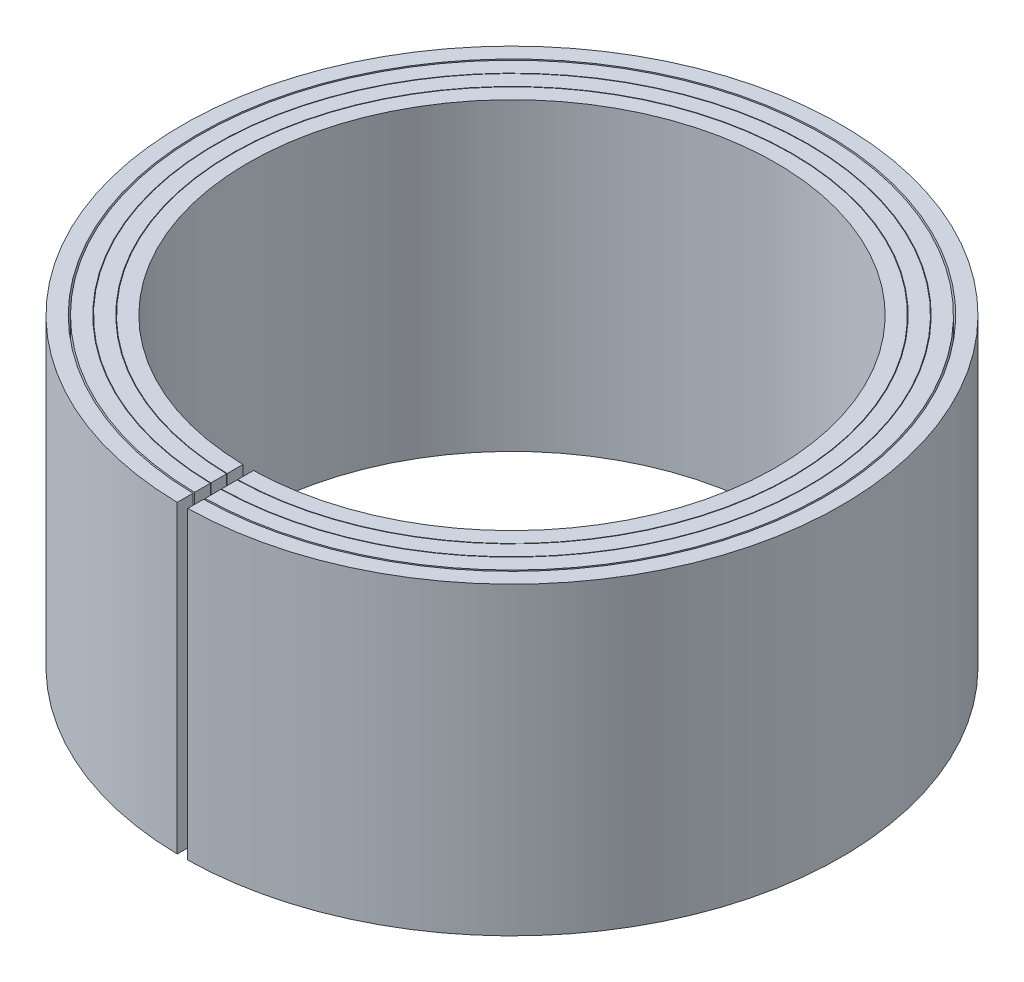
ISO-10303-21;
HEADER;
FILE_DESCRIPTION(('STEP AP214'),'2;1');
FILE_NAME('part.step','',(''),(''),'','','');
FILE_SCHEMA(('AUTOMOTIVE_DESIGN { 1 0 10303 214 1 1 1 1 }'));
ENDSEC;
DATA;
#1=APPLICATION_CONTEXT('core data for automotive mechanical design processes');
#2=APPLICATION_PROTOCOL_DEFINITION('international standard','automotive_design',2000,#1);
#3=PRODUCT_CONTEXT('',#1,'mechanical');
#4=PRODUCT('Part','Part','',(#3));
#5=PRODUCT_RELATED_PRODUCT_CATEGORY('part','',(#4));
#6=PRODUCT_DEFINITION_FORMATION('','',#4);
#7=PRODUCT_DEFINITION_CONTEXT('part definition',#1,'design');
#8=PRODUCT_DEFINITION('design','',#6,#7);
#9=PRODUCT_DEFINITION_SHAPE('','',#8);
#10=(LENGTH_UNIT() NAMED_UNIT(*) SI_UNIT(.MILLI.,.METRE.));
#11=(NAMED_UNIT(*) PLANE_ANGLE_UNIT() SI_UNIT($,.RADIAN.));
#12=(NAMED_UNIT(*) SI_UNIT($,.STERADIAN.) SOLID_ANGLE_UNIT());
#13=UNCERTAINTY_MEASURE_WITH_UNIT(LENGTH_MEASURE(1.E-05),#10,'distance_accuracy_value','');
#14=(GEOMETRIC_REPRESENTATION_CONTEXT(3) GLOBAL_UNCERTAINTY_ASSIGNED_CONTEXT((#13)) GLOBAL_UNIT_ASSIGNED_CONTEXT((#10,
#11,#12)) REPRESENTATION_CONTEXT('',''));
#15=CARTESIAN_POINT('',(0.,0.,0.));
#16=DIRECTION('',(0.,0.,1.));
#17=DIRECTION('',(1.,0.,0.));
#18=AXIS2_PLACEMENT_3D('',#15,#16,#17);
#19=CARTESIAN_POINT('',(0.,177.8,0.));
#20=DIRECTION('',(0.,1.,0.));
#21=DIRECTION('',(0.,0.,1.));
#22=AXIS2_PLACEMENT_3D('',#19,#20,#21);
#23=CYLINDRICAL_SURFACE('',#22,676.275);
#24=CARTESIAN_POINT('',(0.,914.4,0.));
#25=DIRECTION('',(0.,1.,0.));
#26=DIRECTION('',(0.,0.,1.));
#27=AXIS2_PLACEMENT_3D('',#24,#25,#26);
#28=CIRCLE('',#27,676.275);
#29=CARTESIAN_POINT('',(12.7000000000001,914.4,676.155740658171));
#30=VERTEX_POINT('',#29);
#31=CARTESIAN_POINT('',(-12.6999999999999,914.4,676.155740658171));
#32=VERTEX_POINT('',#31);
#33=EDGE_CURVE('E118',#30,#32,#28,.T.);
#34=ORIENTED_EDGE('',*,*,#33,.F.);
#35=DIRECTION('',(0.,1.,0.));
#36=VECTOR('',#35,1.);
#37=CARTESIAN_POINT('',(12.7000000000001,177.8,676.155740658171));
#38=LINE('',#37,#36);
#39=CARTESIAN_POINT('',(12.7000000000001,177.8,676.155740658171));
#40=VERTEX_POINT('',#39);
#41=EDGE_CURVE('E92',#30,#40,#38,.F.);
#42=ORIENTED_EDGE('',*,*,#41,.T.);
#43=CARTESIAN_POINT('',(0.,177.8,0.));
#44=DIRECTION('',(0.,1.,0.));
#45=DIRECTION('',(0.,0.,1.));
#46=AXIS2_PLACEMENT_3D('',#43,#44,#45);
#47=CIRCLE('',#46,676.275);
#48=CARTESIAN_POINT('',(-12.6999999999999,177.8,676.155740658171));
#49=VERTEX_POINT('',#48);
#50=EDGE_CURVE('E120',#40,#49,#47,.T.);
#51=ORIENTED_EDGE('',*,*,#50,.T.);
#52=DIRECTION('',(0.,1.,0.));
#53=VECTOR('',#52,1.);
#54=CARTESIAN_POINT('',(-12.6999999999999,177.8,676.155740658171));
#55=LINE('',#54,#53);
#56=EDGE_CURVE('E108',#49,#32,#55,.T.);
#57=ORIENTED_EDGE('',*,*,#56,.T.);
#58=EDGE_LOOP('',(#34,#42,#51,#57));
#59=FACE_BOUND('',#58,.T.);
#60=ADVANCED_FACE('F70',(#59),#23,.T.);
#61=CARTESIAN_POINT('',(0.,177.8,0.));
#62=DIRECTION('',(0.,1.,0.));
#63=DIRECTION('',(0.,0.,1.));
#64=AXIS2_PLACEMENT_3D('',#61,#62,#63);
#65=CYLINDRICAL_SURFACE('',#64,638.175);
#66=DIRECTION('',(0.,1.,0.));
#67=VECTOR('',#66,1.);
#68=CARTESIAN_POINT('',(12.7000000000001,177.8,638.048619326929));
#69=LINE('',#68,#67);
#70=CARTESIAN_POINT('',(12.7000000000001,914.4,638.048619326929));
#71=VERTEX_POINT('',#70);
#72=CARTESIAN_POINT('',(12.7000000000001,177.8,638.048619326929));
#73=VERTEX_POINT('',#72);
#74=EDGE_CURVE('E127',#71,#73,#69,.F.);
#75=ORIENTED_EDGE('',*,*,#74,.F.);
#76=CARTESIAN_POINT('',(0.,914.4,0.));
#77=DIRECTION('',(0.,1.,0.));
#78=DIRECTION('',(0.,0.,1.));
#79=AXIS2_PLACEMENT_3D('',#76,#77,#78);
#80=CIRCLE('',#79,638.175);
#81=CARTESIAN_POINT('',(-12.6999999999999,914.4,638.048619326929));
#82=VERTEX_POINT('',#81);
#83=EDGE_CURVE('E124',#71,#82,#80,.T.);
#84=ORIENTED_EDGE('',*,*,#83,.T.);
#85=DIRECTION('',(0.,1.,0.));
#86=VECTOR('',#85,1.);
#87=CARTESIAN_POINT('',(-12.6999999999999,177.8,638.048619326929));
#88=LINE('',#87,#86);
#89=CARTESIAN_POINT('',(-12.6999999999999,177.8,638.048619326929));
#90=VERTEX_POINT('',#89);
#91=EDGE_CURVE('E84',#90,#82,#88,.T.);
#92=ORIENTED_EDGE('',*,*,#91,.F.);
#93=CARTESIAN_POINT('',(0.,177.8,0.));
#94=DIRECTION('',(0.,1.,0.));
#95=DIRECTION('',(0.,0.,1.));
#96=AXIS2_PLACEMENT_3D('',#93,#94,#95);
#97=CIRCLE('',#96,638.175);
#98=EDGE_CURVE('E114',#73,#90,#97,.T.);
#99=ORIENTED_EDGE('',*,*,#98,.F.);
#100=EDGE_LOOP('',(#75,#84,#92,#99));
#101=FACE_BOUND('',#100,.T.);
#102=ADVANCED_FACE('F141',(#101),#65,.F.);
#103=CARTESIAN_POINT('',(0.,177.8,0.));
#104=DIRECTION('',(0.,1.,0.));
#105=DIRECTION('',(0.,0.,1.));
#106=AXIS2_PLACEMENT_3D('',#103,#104,#105);
#107=PLANE('',#106);
#108=DIRECTION('',(0.,0.,1.));
#109=VECTOR('',#108,1.);
#110=CARTESIAN_POINT('',(12.7,177.8,0.));
#111=LINE('',#110,#109);
#112=EDGE_CURVE('E121',#73,#40,#111,.T.);
#113=ORIENTED_EDGE('',*,*,#112,.F.);
#114=ORIENTED_EDGE('',*,*,#98,.T.);
#115=DIRECTION('',(0.,0.,-1.));
#116=VECTOR('',#115,1.);
#117=CARTESIAN_POINT('',(-12.7,177.8,0.));
#118=LINE('',#117,#116);
#119=EDGE_CURVE('E136',#49,#90,#118,.T.);
#120=ORIENTED_EDGE('',*,*,#119,.F.);
#121=ORIENTED_EDGE('',*,*,#50,.F.);
#122=EDGE_LOOP('',(#113,#114,#120,#121));
#123=FACE_BOUND('',#122,.T.);
#124=ADVANCED_FACE('F143',(#123),#107,.F.);
#125=CARTESIAN_POINT('',(0.,914.4,0.));
#126=DIRECTION('',(0.,1.,0.));
#127=DIRECTION('',(0.,0.,1.));
#128=AXIS2_PLACEMENT_3D('',#125,#126,#127);
#129=PLANE('',#128);
#130=ORIENTED_EDGE('',*,*,#83,.F.);
#131=DIRECTION('',(0.,0.,1.));
#132=VECTOR('',#131,1.);
#133=CARTESIAN_POINT('',(12.7,914.4,0.));
#134=LINE('',#133,#132);
#135=EDGE_CURVE('E13',#71,#30,#134,.T.);
#136=ORIENTED_EDGE('',*,*,#135,.T.);
#137=ORIENTED_EDGE('',*,*,#33,.T.);
#138=DIRECTION('',(0.,0.,-1.));
#139=VECTOR('',#138,1.);
#140=CARTESIAN_POINT('',(-12.7,914.4,0.));
#141=LINE('',#140,#139);
#142=EDGE_CURVE('E77',#32,#82,#141,.T.);
#143=ORIENTED_EDGE('',*,*,#142,.T.);
#144=EDGE_LOOP('',(#130,#136,#137,#143));
#145=FACE_BOUND('',#144,.T.);
#146=ADVANCED_FACE('F123',(#145),#129,.T.);
#147=CARTESIAN_POINT('',(-12.6999999999999,914.4,542.924999999996));
#148=DIRECTION('',(1.,0.,0.));
#149=DIRECTION('',(0.,0.,-1.));
#150=AXIS2_PLACEMENT_3D('',#147,#148,#149);
#151=PLANE('',#150);
#152=ORIENTED_EDGE('',*,*,#119,.T.);
#153=ORIENTED_EDGE('',*,*,#91,.T.);
#154=ORIENTED_EDGE('',*,*,#142,.F.);
#155=ORIENTED_EDGE('',*,*,#56,.F.);
#156=EDGE_LOOP('',(#152,#153,#154,#155));
#157=FACE_BOUND('',#156,.T.);
#158=ADVANCED_FACE('F107',(#157),#151,.T.);
#159=CARTESIAN_POINT('',(12.7000000000001,914.4,542.924999999996));
#160=DIRECTION('',(-1.,0.,0.));
#161=DIRECTION('',(0.,0.,1.));
#162=AXIS2_PLACEMENT_3D('',#159,#160,#161);
#163=PLANE('',#162);
#164=ORIENTED_EDGE('',*,*,#135,.F.);
#165=ORIENTED_EDGE('',*,*,#74,.T.);
#166=ORIENTED_EDGE('',*,*,#112,.T.);
#167=ORIENTED_EDGE('',*,*,#41,.F.);
#168=EDGE_LOOP('',(#164,#165,#166,#167));
#169=FACE_BOUND('',#168,.T.);
#170=ADVANCED_FACE('F144',(#169),#163,.T.);
#171=CLOSED_SHELL('',(#60,#102,#124,#146,#158,#170));
#172=MANIFOLD_SOLID_BREP('B2',#171);
#173=CARTESIAN_POINT('',(0.,177.8,0.));
#174=DIRECTION('',(0.,1.,0.));
#175=DIRECTION('',(0.,0.,1.));
#176=AXIS2_PLACEMENT_3D('',#173,#174,#175);
#177=CYLINDRICAL_SURFACE('',#176,677.545);
#178=DIRECTION('',(0.,1.,0.));
#179=VECTOR('',#178,1.);
#180=CARTESIAN_POINT('',(12.7000000000001,177.8,677.425964238897));
#181=LINE('',#180,#179);
#182=CARTESIAN_POINT('',(12.7000000000001,914.4,677.425964238897));
#183=VERTEX_POINT('',#182);
#184=CARTESIAN_POINT('',(12.7000000000001,177.8,677.425964238897));
#185=VERTEX_POINT('',#184);
#186=EDGE_CURVE('E263',#183,#185,#181,.F.);
#187=ORIENTED_EDGE('',*,*,#186,.F.);
#188=CARTESIAN_POINT('',(0.,914.4,0.));
#189=DIRECTION('',(0.,1.,0.));
#190=DIRECTION('',(0.,0.,1.));
#191=AXIS2_PLACEMENT_3D('',#188,#189,#190);
#192=CIRCLE('',#191,677.545);
#193=CARTESIAN_POINT('',(-12.6999999999999,914.4,677.425964238897));
#194=VERTEX_POINT('',#193);
#195=EDGE_CURVE('E259',#183,#194,#192,.T.);
#196=ORIENTED_EDGE('',*,*,#195,.T.);
#197=DIRECTION('',(0.,1.,0.));
#198=VECTOR('',#197,1.);
#199=CARTESIAN_POINT('',(-12.6999999999999,177.8,677.425964238897));
#200=LINE('',#199,#198);
#201=CARTESIAN_POINT('',(-12.6999999999999,177.8,677.425964238897));
#202=VERTEX_POINT('',#201);
#203=EDGE_CURVE('E225',#202,#194,#200,.T.);
#204=ORIENTED_EDGE('',*,*,#203,.F.);
#205=CARTESIAN_POINT('',(0.,177.8,0.));
#206=DIRECTION('',(0.,1.,0.));
#207=DIRECTION('',(0.,0.,1.));
#208=AXIS2_PLACEMENT_3D('',#205,#206,#207);
#209=CIRCLE('',#208,677.545);
#210=EDGE_CURVE('E258',#185,#202,#209,.T.);
#211=ORIENTED_EDGE('',*,*,#210,.F.);
#212=EDGE_LOOP('',(#187,#196,#204,#211));
#213=FACE_BOUND('',#212,.T.);
#214=ADVANCED_FACE('F204',(#213),#177,.F.);
#215=CARTESIAN_POINT('',(0.,177.8,0.));
#216=DIRECTION('',(0.,1.,0.));
#217=DIRECTION('',(0.,0.,1.));
#218=AXIS2_PLACEMENT_3D('',#215,#216,#217);
#219=CYLINDRICAL_SURFACE('',#218,715.645);
#220=CARTESIAN_POINT('',(0.,914.4,0.));
#221=DIRECTION('',(0.,1.,0.));
#222=DIRECTION('',(0.,0.,1.));
#223=AXIS2_PLACEMENT_3D('',#220,#221,#222);
#224=CIRCLE('',#223,715.645);
#225=CARTESIAN_POINT('',(12.7000000000001,914.4,715.532302572707));
#226=VERTEX_POINT('',#225);
#227=CARTESIAN_POINT('',(-12.6999999999999,914.4,715.532302572707));
#228=VERTEX_POINT('',#227);
#229=EDGE_CURVE('E253',#226,#228,#224,.T.);
#230=ORIENTED_EDGE('',*,*,#229,.F.);
#231=DIRECTION('',(0.,1.,0.));
#232=VECTOR('',#231,1.);
#233=CARTESIAN_POINT('',(12.7000000000001,177.8,715.532302572707));
#234=LINE('',#233,#232);
#235=CARTESIAN_POINT('',(12.7000000000001,177.8,715.532302572707));
#236=VERTEX_POINT('',#235);
#237=EDGE_CURVE('E218',#226,#236,#234,.F.);
#238=ORIENTED_EDGE('',*,*,#237,.T.);
#239=CARTESIAN_POINT('',(0.,177.8,0.));
#240=DIRECTION('',(0.,1.,0.));
#241=DIRECTION('',(0.,0.,1.));
#242=AXIS2_PLACEMENT_3D('',#239,#240,#241);
#243=CIRCLE('',#242,715.645);
#244=CARTESIAN_POINT('',(-12.6999999999999,177.8,715.532302572707));
#245=VERTEX_POINT('',#244);
#246=EDGE_CURVE('E248',#236,#245,#243,.T.);
#247=ORIENTED_EDGE('',*,*,#246,.T.);
#248=DIRECTION('',(0.,1.,0.));
#249=VECTOR('',#248,1.);
#250=CARTESIAN_POINT('',(-12.6999999999999,177.8,715.532302572707));
#251=LINE('',#250,#249);
#252=EDGE_CURVE('E242',#245,#228,#251,.T.);
#253=ORIENTED_EDGE('',*,*,#252,.T.);
#254=EDGE_LOOP('',(#230,#238,#247,#253));
#255=FACE_BOUND('',#254,.T.);
#256=ADVANCED_FACE('F252',(#255),#219,.T.);
#257=CARTESIAN_POINT('',(0.,177.8,0.));
#258=DIRECTION('',(0.,1.,0.));
#259=DIRECTION('',(0.,0.,1.));
#260=AXIS2_PLACEMENT_3D('',#257,#258,#259);
#261=PLANE('',#260);
#262=DIRECTION('',(0.,0.,1.));
#263=VECTOR('',#262,1.);
#264=CARTESIAN_POINT('',(12.7,177.8,0.));
#265=LINE('',#264,#263);
#266=EDGE_CURVE('E269',#185,#236,#265,.T.);
#267=ORIENTED_EDGE('',*,*,#266,.F.);
#268=ORIENTED_EDGE('',*,*,#210,.T.);
#269=DIRECTION('',(0.,0.,-1.));
#270=VECTOR('',#269,1.);
#271=CARTESIAN_POINT('',(-12.7,177.8,0.));
#272=LINE('',#271,#270);
#273=EDGE_CURVE('E255',#245,#202,#272,.T.);
#274=ORIENTED_EDGE('',*,*,#273,.F.);
#275=ORIENTED_EDGE('',*,*,#246,.F.);
#276=EDGE_LOOP('',(#267,#268,#274,#275));
#277=FACE_BOUND('',#276,.T.);
#278=ADVANCED_FACE('F277',(#277),#261,.F.);
#279=CARTESIAN_POINT('',(0.,914.4,0.));
#280=DIRECTION('',(0.,1.,0.));
#281=DIRECTION('',(0.,0.,1.));
#282=AXIS2_PLACEMENT_3D('',#279,#280,#281);
#283=PLANE('',#282);
#284=ORIENTED_EDGE('',*,*,#195,.F.);
#285=DIRECTION('',(0.,0.,1.));
#286=VECTOR('',#285,1.);
#287=CARTESIAN_POINT('',(12.7,914.4,0.));
#288=LINE('',#287,#286);
#289=EDGE_CURVE('E68',#183,#226,#288,.T.);
#290=ORIENTED_EDGE('',*,*,#289,.T.);
#291=ORIENTED_EDGE('',*,*,#229,.T.);
#292=DIRECTION('',(0.,0.,-1.));
#293=VECTOR('',#292,1.);
#294=CARTESIAN_POINT('',(-12.7,914.4,0.));
#295=LINE('',#294,#293);
#296=EDGE_CURVE('E211',#228,#194,#295,.T.);
#297=ORIENTED_EDGE('',*,*,#296,.T.);
#298=EDGE_LOOP('',(#284,#290,#291,#297));
#299=FACE_BOUND('',#298,.T.);
#300=ADVANCED_FACE('F257',(#299),#283,.T.);
#301=CARTESIAN_POINT('',(-12.6999999999999,914.4,542.924999999996));
#302=DIRECTION('',(1.,0.,0.));
#303=DIRECTION('',(0.,0.,-1.));
#304=AXIS2_PLACEMENT_3D('',#301,#302,#303);
#305=PLANE('',#304);
#306=ORIENTED_EDGE('',*,*,#203,.T.);
#307=ORIENTED_EDGE('',*,*,#296,.F.);
#308=ORIENTED_EDGE('',*,*,#252,.F.);
#309=ORIENTED_EDGE('',*,*,#273,.T.);
#310=EDGE_LOOP('',(#306,#307,#308,#309));
#311=FACE_BOUND('',#310,.T.);
#312=ADVANCED_FACE('F241',(#311),#305,.T.);
#313=CARTESIAN_POINT('',(12.7000000000001,914.4,542.924999999996));
#314=DIRECTION('',(-1.,0.,0.));
#315=DIRECTION('',(0.,0.,1.));
#316=AXIS2_PLACEMENT_3D('',#313,#314,#315);
#317=PLANE('',#316);
#318=ORIENTED_EDGE('',*,*,#186,.T.);
#319=ORIENTED_EDGE('',*,*,#266,.T.);
#320=ORIENTED_EDGE('',*,*,#237,.F.);
#321=ORIENTED_EDGE('',*,*,#289,.F.);
#322=EDGE_LOOP('',(#318,#319,#320,#321));
#323=FACE_BOUND('',#322,.T.);
#324=ADVANCED_FACE('F278',(#323),#317,.T.);
#325=CLOSED_SHELL('',(#214,#256,#278,#300,#312,#324));
#326=MANIFOLD_SOLID_BREP('B7',#325);
#327=CARTESIAN_POINT('',(0.,177.8,0.));
#328=DIRECTION('',(0.,1.,0.));
#329=DIRECTION('',(0.,0.,1.));
#330=AXIS2_PLACEMENT_3D('',#327,#328,#329);
#331=CYLINDRICAL_SURFACE('',#330,716.915);
#332=DIRECTION('',(0.,1.,0.));
#333=VECTOR('',#332,1.);
#334=CARTESIAN_POINT('',(12.7000000000001,177.8,716.802502245214));
#335=LINE('',#334,#333);
#336=CARTESIAN_POINT('',(12.7000000000001,914.4,716.802502245214));
#337=VERTEX_POINT('',#336);
#338=CARTESIAN_POINT('',(12.7000000000001,177.8,716.802502245214));
#339=VERTEX_POINT('',#338);
#340=EDGE_CURVE('E396',#337,#339,#335,.F.);
#341=ORIENTED_EDGE('',*,*,#340,.F.);
#342=CARTESIAN_POINT('',(0.,914.4,0.));
#343=DIRECTION('',(0.,1.,0.));
#344=DIRECTION('',(0.,0.,1.));
#345=AXIS2_PLACEMENT_3D('',#342,#343,#344);
#346=CIRCLE('',#345,716.915);
#347=CARTESIAN_POINT('',(-12.6999999999999,914.4,716.802502245214));
#348=VERTEX_POINT('',#347);
#349=EDGE_CURVE('E392',#337,#348,#346,.T.);
#350=ORIENTED_EDGE('',*,*,#349,.T.);
#351=DIRECTION('',(0.,1.,0.));
#352=VECTOR('',#351,1.);
#353=CARTESIAN_POINT('',(-12.6999999999999,177.8,716.802502245214));
#354=LINE('',#353,#352);
#355=CARTESIAN_POINT('',(-12.6999999999999,177.8,716.802502245214));
#356=VERTEX_POINT('',#355);
#357=EDGE_CURVE('E358',#356,#348,#354,.T.);
#358=ORIENTED_EDGE('',*,*,#357,.F.);
#359=CARTESIAN_POINT('',(0.,177.8,0.));
#360=DIRECTION('',(0.,1.,0.));
#361=DIRECTION('',(0.,0.,1.));
#362=AXIS2_PLACEMENT_3D('',#359,#360,#361);
#363=CIRCLE('',#362,716.915);
#364=EDGE_CURVE('E391',#339,#356,#363,.T.);
#365=ORIENTED_EDGE('',*,*,#364,.F.);
#366=EDGE_LOOP('',(#341,#350,#358,#365));
#367=FACE_BOUND('',#366,.T.);
#368=ADVANCED_FACE('F337',(#367),#331,.F.);
#369=CARTESIAN_POINT('',(0.,177.8,0.));
#370=DIRECTION('',(0.,1.,0.));
#371=DIRECTION('',(0.,0.,1.));
#372=AXIS2_PLACEMENT_3D('',#369,#370,#371);
#373=CYLINDRICAL_SURFACE('',#372,755.015);
#374=CARTESIAN_POINT('',(0.,914.4,0.));
#375=DIRECTION('',(0.,1.,0.));
#376=DIRECTION('',(0.,0.,1.));
#377=AXIS2_PLACEMENT_3D('',#374,#375,#376);
#378=CIRCLE('',#377,755.015);
#379=CARTESIAN_POINT('',(12.7000000000001,914.4,754.908179996084));
#380=VERTEX_POINT('',#379);
#381=CARTESIAN_POINT('',(-12.6999999999999,914.4,754.908179996084));
#382=VERTEX_POINT('',#381);
#383=EDGE_CURVE('E386',#380,#382,#378,.T.);
#384=ORIENTED_EDGE('',*,*,#383,.F.);
#385=DIRECTION('',(0.,1.,0.));
#386=VECTOR('',#385,1.);
#387=CARTESIAN_POINT('',(12.7000000000001,177.8,754.908179996084));
#388=LINE('',#387,#386);
#389=CARTESIAN_POINT('',(12.7000000000001,177.8,754.908179996084));
#390=VERTEX_POINT('',#389);
#391=EDGE_CURVE('E351',#380,#390,#388,.F.);
#392=ORIENTED_EDGE('',*,*,#391,.T.);
#393=CARTESIAN_POINT('',(0.,177.8,0.));
#394=DIRECTION('',(0.,1.,0.));
#395=DIRECTION('',(0.,0.,1.));
#396=AXIS2_PLACEMENT_3D('',#393,#394,#395);
#397=CIRCLE('',#396,755.015);
#398=CARTESIAN_POINT('',(-12.6999999999999,177.8,754.908179996084));
#399=VERTEX_POINT('',#398);
#400=EDGE_CURVE('E381',#390,#399,#397,.T.);
#401=ORIENTED_EDGE('',*,*,#400,.T.);
#402=DIRECTION('',(0.,1.,0.));
#403=VECTOR('',#402,1.);
#404=CARTESIAN_POINT('',(-12.6999999999999,177.8,754.908179996084));
#405=LINE('',#404,#403);
#406=EDGE_CURVE('E375',#399,#382,#405,.T.);
#407=ORIENTED_EDGE('',*,*,#406,.T.);
#408=EDGE_LOOP('',(#384,#392,#401,#407));
#409=FACE_BOUND('',#408,.T.);
#410=ADVANCED_FACE('F385',(#409),#373,.T.);
#411=CARTESIAN_POINT('',(0.,177.8,0.));
#412=DIRECTION('',(0.,1.,0.));
#413=DIRECTION('',(0.,0.,1.));
#414=AXIS2_PLACEMENT_3D('',#411,#412,#413);
#415=PLANE('',#414);
#416=DIRECTION('',(0.,0.,1.));
#417=VECTOR('',#416,1.);
#418=CARTESIAN_POINT('',(12.7,177.8,0.));
#419=LINE('',#418,#417);
#420=EDGE_CURVE('E402',#339,#390,#419,.T.);
#421=ORIENTED_EDGE('',*,*,#420,.F.);
#422=ORIENTED_EDGE('',*,*,#364,.T.);
#423=DIRECTION('',(0.,0.,-1.));
#424=VECTOR('',#423,1.);
#425=CARTESIAN_POINT('',(-12.7,177.8,0.));
#426=LINE('',#425,#424);
#427=EDGE_CURVE('E388',#399,#356,#426,.T.);
#428=ORIENTED_EDGE('',*,*,#427,.F.);
#429=ORIENTED_EDGE('',*,*,#400,.F.);
#430=EDGE_LOOP('',(#421,#422,#428,#429));
#431=FACE_BOUND('',#430,.T.);
#432=ADVANCED_FACE('F410',(#431),#415,.F.);
#433=CARTESIAN_POINT('',(0.,914.4,0.));
#434=DIRECTION('',(0.,1.,0.));
#435=DIRECTION('',(0.,0.,1.));
#436=AXIS2_PLACEMENT_3D('',#433,#434,#435);
#437=PLANE('',#436);
#438=ORIENTED_EDGE('',*,*,#349,.F.);
#439=DIRECTION('',(0.,0.,1.));
#440=VECTOR('',#439,1.);
#441=CARTESIAN_POINT('',(12.7,914.4,0.));
#442=LINE('',#441,#440);
#443=EDGE_CURVE('E202',#337,#380,#442,.T.);
#444=ORIENTED_EDGE('',*,*,#443,.T.);
#445=ORIENTED_EDGE('',*,*,#383,.T.);
#446=DIRECTION('',(0.,0.,-1.));
#447=VECTOR('',#446,1.);
#448=CARTESIAN_POINT('',(-12.7,914.4,0.));
#449=LINE('',#448,#447);
#450=EDGE_CURVE('E344',#382,#348,#449,.T.);
#451=ORIENTED_EDGE('',*,*,#450,.T.);
#452=EDGE_LOOP('',(#438,#444,#445,#451));
#453=FACE_BOUND('',#452,.T.);
#454=ADVANCED_FACE('F390',(#453),#437,.T.);
#455=CARTESIAN_POINT('',(-12.6999999999999,914.4,542.924999999996));
#456=DIRECTION('',(1.,0.,0.));
#457=DIRECTION('',(0.,0.,-1.));
#458=AXIS2_PLACEMENT_3D('',#455,#456,#457);
#459=PLANE('',#458);
#460=ORIENTED_EDGE('',*,*,#357,.T.);
#461=ORIENTED_EDGE('',*,*,#450,.F.);
#462=ORIENTED_EDGE('',*,*,#406,.F.);
#463=ORIENTED_EDGE('',*,*,#427,.T.);
#464=EDGE_LOOP('',(#460,#461,#462,#463));
#465=FACE_BOUND('',#464,.T.);
#466=ADVANCED_FACE('F374',(#465),#459,.T.);
#467=CARTESIAN_POINT('',(12.7000000000001,914.4,542.924999999996));
#468=DIRECTION('',(-1.,0.,0.));
#469=DIRECTION('',(0.,0.,1.));
#470=AXIS2_PLACEMENT_3D('',#467,#468,#469);
#471=PLANE('',#470);
#472=ORIENTED_EDGE('',*,*,#340,.T.);
#473=ORIENTED_EDGE('',*,*,#420,.T.);
#474=ORIENTED_EDGE('',*,*,#391,.F.);
#475=ORIENTED_EDGE('',*,*,#443,.F.);
#476=EDGE_LOOP('',(#472,#473,#474,#475));
#477=FACE_BOUND('',#476,.T.);
#478=ADVANCED_FACE('F411',(#477),#471,.T.);
#479=CLOSED_SHELL('',(#368,#410,#432,#454,#466,#478));
#480=MANIFOLD_SOLID_BREP('B62',#479);
#481=CARTESIAN_POINT('',(0.,914.4,0.));
#482=DIRECTION('',(0.,1.,0.));
#483=DIRECTION('',(0.,0.,1.));
#484=AXIS2_PLACEMENT_3D('',#481,#482,#483);
#485=PLANE('',#484);
#486=CARTESIAN_POINT('',(0.,914.4,0.));
#487=DIRECTION('',(0.,1.,0.));
#488=DIRECTION('',(0.,0.,1.));
#489=AXIS2_PLACEMENT_3D('',#486,#487,#488);
#490=CIRCLE('',#489,758.825);
#491=CARTESIAN_POINT('',(12.7000000000001,914.4,758.718716406153));
#492=VERTEX_POINT('',#491);
#493=CARTESIAN_POINT('',(-12.6999999999999,914.4,758.718716406153));
#494=VERTEX_POINT('',#493);
#495=EDGE_CURVE('E525',#492,#494,#490,.T.);
#496=ORIENTED_EDGE('',*,*,#495,.F.);
#497=DIRECTION('',(0.,0.,-1.));
#498=VECTOR('',#497,1.);
#499=CARTESIAN_POINT('',(12.7000000000001,914.4,542.924999999996));
#500=LINE('',#499,#498);
#501=CARTESIAN_POINT('',(12.7000000000001,914.4,796.823798355069));
#502=VERTEX_POINT('',#501);
#503=EDGE_CURVE('E515',#502,#492,#500,.T.);
#504=ORIENTED_EDGE('',*,*,#503,.F.);
#505=CARTESIAN_POINT('',(0.,914.4,0.));
#506=DIRECTION('',(0.,1.,0.));
#507=DIRECTION('',(0.,0.,1.));
#508=AXIS2_PLACEMENT_3D('',#505,#506,#507);
#509=CIRCLE('',#508,796.925);
#510=CARTESIAN_POINT('',(-12.6999999999999,914.4,796.823798355069));
#511=VERTEX_POINT('',#510);
#512=EDGE_CURVE('E527',#502,#511,#509,.T.);
#513=ORIENTED_EDGE('',*,*,#512,.T.);
#514=DIRECTION('',(0.,0.,1.));
#515=VECTOR('',#514,1.);
#516=CARTESIAN_POINT('',(-12.6999999999999,914.4,542.924999999996));
#517=LINE('',#516,#515);
#518=EDGE_CURVE('E522',#494,#511,#517,.T.);
#519=ORIENTED_EDGE('',*,*,#518,.F.);
#520=EDGE_LOOP('',(#496,#504,#513,#519));
#521=FACE_BOUND('',#520,.T.);
#522=ADVANCED_FACE('F461',(#521),#485,.T.);
#523=CARTESIAN_POINT('',(0.,914.4,0.));
#524=DIRECTION('',(0.,-1.,0.));
#525=DIRECTION('',(0.,0.,-1.));
#526=AXIS2_PLACEMENT_3D('',#523,#524,#525);
#527=CYLINDRICAL_SURFACE('',#526,796.925);
#528=DIRECTION('',(0.,-1.,0.));
#529=VECTOR('',#528,1.);
#530=CARTESIAN_POINT('',(12.7000000000001,914.4,796.823798355069));
#531=LINE('',#530,#529);
#532=CARTESIAN_POINT('',(12.7000000000001,177.8,796.823798355069));
#533=VERTEX_POINT('',#532);
#534=EDGE_CURVE('E517',#533,#502,#531,.F.);
#535=ORIENTED_EDGE('',*,*,#534,.F.);
#536=CARTESIAN_POINT('',(0.,177.8,0.));
#537=DIRECTION('',(0.,1.,0.));
#538=DIRECTION('',(0.,0.,1.));
#539=AXIS2_PLACEMENT_3D('',#536,#537,#538);
#540=CIRCLE('',#539,796.925);
#541=CARTESIAN_POINT('',(-12.6999999999999,177.8,796.823798355069));
#542=VERTEX_POINT('',#541);
#543=EDGE_CURVE('E477',#542,#533,#540,.F.);
#544=ORIENTED_EDGE('',*,*,#543,.F.);
#545=DIRECTION('',(0.,-1.,0.));
#546=VECTOR('',#545,1.);
#547=CARTESIAN_POINT('',(-12.6999999999999,914.4,796.823798355069));
#548=LINE('',#547,#546);
#549=EDGE_CURVE('E532',#511,#542,#548,.T.);
#550=ORIENTED_EDGE('',*,*,#549,.F.);
#551=ORIENTED_EDGE('',*,*,#512,.F.);
#552=EDGE_LOOP('',(#535,#544,#550,#551));
#553=FACE_BOUND('',#552,.T.);
#554=ADVANCED_FACE('F463',(#553),#527,.T.);
#555=CARTESIAN_POINT('',(0.,914.4,0.));
#556=DIRECTION('',(0.,-1.,0.));
#557=DIRECTION('',(0.,0.,-1.));
#558=AXIS2_PLACEMENT_3D('',#555,#556,#557);
#559=CYLINDRICAL_SURFACE('',#558,758.825);
#560=CARTESIAN_POINT('',(0.,177.8,0.));
#561=DIRECTION('',(0.,1.,0.));
#562=DIRECTION('',(0.,0.,1.));
#563=AXIS2_PLACEMENT_3D('',#560,#561,#562);
#564=CIRCLE('',#563,758.825);
#565=CARTESIAN_POINT('',(12.7000000000001,177.8,758.718716406153));
#566=VERTEX_POINT('',#565);
#567=CARTESIAN_POINT('',(-12.6999999999997,177.8,758.718716406153));
#568=VERTEX_POINT('',#567);
#569=EDGE_CURVE('E502',#566,#568,#564,.T.);
#570=ORIENTED_EDGE('',*,*,#569,.F.);
#571=DIRECTION('',(0.,-1.,0.));
#572=VECTOR('',#571,1.);
#573=CARTESIAN_POINT('',(12.7000000000001,914.4,758.718716406153));
#574=LINE('',#573,#572);
#575=EDGE_CURVE('E335',#566,#492,#574,.F.);
#576=ORIENTED_EDGE('',*,*,#575,.T.);
#577=ORIENTED_EDGE('',*,*,#495,.T.);
#578=DIRECTION('',(0.,-1.,0.));
#579=VECTOR('',#578,1.);
#580=CARTESIAN_POINT('',(-12.6999999999999,914.4,758.718716406153));
#581=LINE('',#580,#579);
#582=EDGE_CURVE('E470',#494,#568,#581,.T.);
#583=ORIENTED_EDGE('',*,*,#582,.T.);
#584=EDGE_LOOP('',(#570,#576,#577,#583));
#585=FACE_BOUND('',#584,.T.);
#586=ADVANCED_FACE('F509',(#585),#559,.F.);
#587=CARTESIAN_POINT('',(-12.6999999999999,914.4,542.924999999996));
#588=DIRECTION('',(1.,0.,0.));
#589=DIRECTION('',(0.,0.,-1.));
#590=AXIS2_PLACEMENT_3D('',#587,#588,#589);
#591=PLANE('',#590);
#592=DIRECTION('',(0.,0.,1.));
#593=VECTOR('',#592,1.);
#594=CARTESIAN_POINT('',(-12.7,177.8,758.718716406153));
#595=LINE('',#594,#593);
#596=EDGE_CURVE('E511',#568,#542,#595,.T.);
#597=ORIENTED_EDGE('',*,*,#596,.F.);
#598=ORIENTED_EDGE('',*,*,#582,.F.);
#599=ORIENTED_EDGE('',*,*,#518,.T.);
#600=ORIENTED_EDGE('',*,*,#549,.T.);
#601=EDGE_LOOP('',(#597,#598,#599,#600));
#602=FACE_BOUND('',#601,.T.);
#603=ADVANCED_FACE('F547',(#602),#591,.T.);
#604=CARTESIAN_POINT('',(12.7000000000001,914.4,542.924999999996));
#605=DIRECTION('',(-1.,0.,0.));
#606=DIRECTION('',(0.,0.,1.));
#607=AXIS2_PLACEMENT_3D('',#604,#605,#606);
#608=PLANE('',#607);
#609=DIRECTION('',(0.,0.,-1.));
#610=VECTOR('',#609,1.);
#611=CARTESIAN_POINT('',(12.7000000000001,177.8,796.823798355069));
#612=LINE('',#611,#610);
#613=EDGE_CURVE('E500',#533,#566,#612,.T.);
#614=ORIENTED_EDGE('',*,*,#613,.F.);
#615=ORIENTED_EDGE('',*,*,#534,.T.);
#616=ORIENTED_EDGE('',*,*,#503,.T.);
#617=ORIENTED_EDGE('',*,*,#575,.F.);
#618=EDGE_LOOP('',(#614,#615,#616,#617));
#619=FACE_BOUND('',#618,.T.);
#620=ADVANCED_FACE('F513',(#619),#608,.T.);
#621=CARTESIAN_POINT('',(0.,177.8,0.));
#622=DIRECTION('',(0.,1.,0.));
#623=DIRECTION('',(0.,0.,1.));
#624=AXIS2_PLACEMENT_3D('',#621,#622,#623);
#625=PLANE('',#624);
#626=ORIENTED_EDGE('',*,*,#543,.T.);
#627=ORIENTED_EDGE('',*,*,#613,.T.);
#628=ORIENTED_EDGE('',*,*,#569,.T.);
#629=ORIENTED_EDGE('',*,*,#596,.T.);
#630=EDGE_LOOP('',(#626,#627,#628,#629));
#631=FACE_BOUND('',#630,.T.);
#632=ADVANCED_FACE('F501',(#631),#625,.F.);
#633=CLOSED_SHELL('',(#522,#554,#586,#603,#620,#632));
#634=MANIFOLD_SOLID_BREP('B196',#633);
#635=ADVANCED_BREP_SHAPE_REPRESENTATION('',(#18,#172,#326,#480,#634),#14);
#636=SHAPE_DEFINITION_REPRESENTATION(#9,#635);
ENDSEC;
END-ISO-10303-21;
